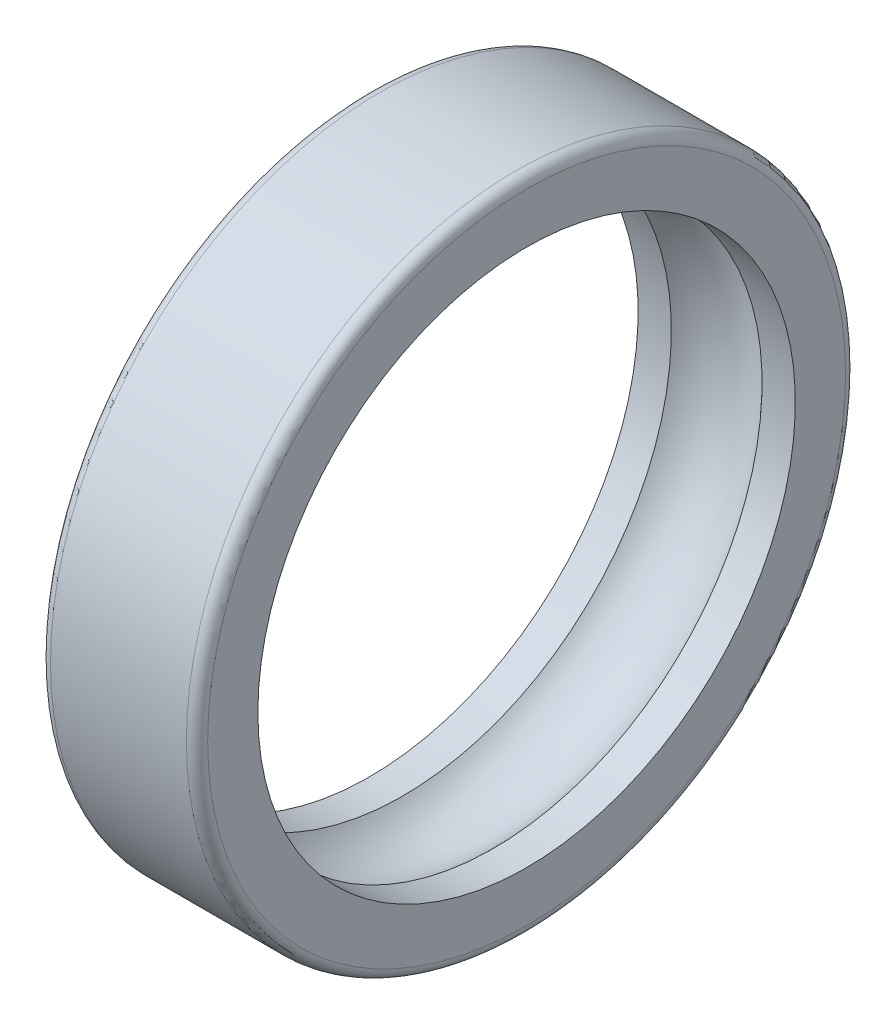
ISO-10303-21;
HEADER;
FILE_DESCRIPTION(('STEP AP214'),'2;1');
FILE_NAME('part.step','',(''),(''),'','','');
FILE_SCHEMA(('AUTOMOTIVE_DESIGN { 1 0 10303 214 1 1 1 1 }'));
ENDSEC;
DATA;
#1=APPLICATION_CONTEXT('core data for automotive mechanical design processes');
#2=APPLICATION_PROTOCOL_DEFINITION('international standard','automotive_design',2000,#1);
#3=PRODUCT_CONTEXT('',#1,'mechanical');
#4=PRODUCT('Part','Part','',(#3));
#5=PRODUCT_RELATED_PRODUCT_CATEGORY('part','',(#4));
#6=PRODUCT_DEFINITION_FORMATION('','',#4);
#7=PRODUCT_DEFINITION_CONTEXT('part definition',#1,'design');
#8=PRODUCT_DEFINITION('design','',#6,#7);
#9=PRODUCT_DEFINITION_SHAPE('','',#8);
#10=(LENGTH_UNIT() NAMED_UNIT(*) SI_UNIT(.MILLI.,.METRE.));
#11=(NAMED_UNIT(*) PLANE_ANGLE_UNIT() SI_UNIT($,.RADIAN.));
#12=(NAMED_UNIT(*) SI_UNIT($,.STERADIAN.) SOLID_ANGLE_UNIT());
#13=UNCERTAINTY_MEASURE_WITH_UNIT(LENGTH_MEASURE(1.E-05),#10,'distance_accuracy_value','');
#14=(GEOMETRIC_REPRESENTATION_CONTEXT(3) GLOBAL_UNCERTAINTY_ASSIGNED_CONTEXT((#13)) GLOBAL_UNIT_ASSIGNED_CONTEXT((#10,
#11,#12)) REPRESENTATION_CONTEXT('',''));
#15=CARTESIAN_POINT('',(0.,0.,0.));
#16=DIRECTION('',(0.,0.,1.));
#17=DIRECTION('',(1.,0.,0.));
#18=AXIS2_PLACEMENT_3D('',#15,#16,#17);
#19=CARTESIAN_POINT('',(-35.8469928467917,0.,0.));
#20=DIRECTION('',(-1.,0.,0.));
#21=DIRECTION('',(0.,0.,1.));
#22=AXIS2_PLACEMENT_3D('',#19,#20,#21);
#23=CYLINDRICAL_SURFACE('',#22,74.9213888883);
#24=CARTESIAN_POINT('',(21.91097222205,0.,0.));
#25=DIRECTION('',(-1.,0.,0.));
#26=DIRECTION('',(0.,0.,1.));
#27=AXIS2_PLACEMENT_3D('',#24,#25,#26);
#28=CIRCLE('',#27,74.9213888883);
#29=CARTESIAN_POINT('',(21.91097222205,0.,74.9213888883));
#30=VERTEX_POINT('',#29);
#31=EDGE_CURVE('E73',#30,#30,#28,.T.);
#32=ORIENTED_EDGE('',*,*,#31,.F.);
#33=EDGE_LOOP('',(#32));
#34=FACE_BOUND('',#33,.T.);
#35=CARTESIAN_POINT('',(12.6437221526744,0.,0.));
#36=DIRECTION('',(-1.,0.,0.));
#37=DIRECTION('',(0.,0.,1.));
#38=AXIS2_PLACEMENT_3D('',#35,#36,#37);
#39=CIRCLE('',#38,74.9213888883);
#40=CARTESIAN_POINT('',(12.6437221526744,0.,74.9213888883));
#41=VERTEX_POINT('',#40);
#42=EDGE_CURVE('E61',#41,#41,#39,.T.);
#43=ORIENTED_EDGE('',*,*,#42,.T.);
#44=EDGE_LOOP('',(#43));
#45=FACE_BOUND('',#44,.T.);
#46=ADVANCED_FACE('F37',(#34,#45),#23,.F.);
#47=CARTESIAN_POINT('',(0.,0.,0.));
#48=DIRECTION('',(-1.,0.,0.));
#49=DIRECTION('',(0.,0.,1.));
#50=AXIS2_PLACEMENT_3D('',#47,#48,#49);
#51=TOROIDAL_SURFACE('',#50,63.6124999995,16.9633333332);
#52=ORIENTED_EDGE('',*,*,#42,.F.);
#53=EDGE_LOOP('',(#52));
#54=FACE_BOUND('',#53,.T.);
#55=CARTESIAN_POINT('',(-12.6437221526744,0.,0.));
#56=DIRECTION('',(-1.,0.,0.));
#57=DIRECTION('',(0.,0.,1.));
#58=AXIS2_PLACEMENT_3D('',#55,#56,#57);
#59=CIRCLE('',#58,74.9213888883);
#60=CARTESIAN_POINT('',(-12.6437221526744,0.,74.9213888883));
#61=VERTEX_POINT('',#60);
#62=EDGE_CURVE('E65',#61,#61,#59,.T.);
#63=ORIENTED_EDGE('',*,*,#62,.T.);
#64=EDGE_LOOP('',(#63));
#65=FACE_BOUND('',#64,.T.);
#66=ADVANCED_FACE('F82',(#54,#65),#51,.F.);
#67=CARTESIAN_POINT('',(-35.8469928467917,0.,0.));
#68=DIRECTION('',(-1.,0.,0.));
#69=DIRECTION('',(0.,0.,1.));
#70=AXIS2_PLACEMENT_3D('',#67,#68,#69);
#71=CYLINDRICAL_SURFACE('',#70,74.9213888883);
#72=ORIENTED_EDGE('',*,*,#62,.F.);
#73=EDGE_LOOP('',(#72));
#74=FACE_BOUND('',#73,.T.);
#75=CARTESIAN_POINT('',(-21.91097222205,0.,0.));
#76=DIRECTION('',(-1.,0.,0.));
#77=DIRECTION('',(0.,0.,1.));
#78=AXIS2_PLACEMENT_3D('',#75,#76,#77);
#79=CIRCLE('',#78,74.9213888883);
#80=CARTESIAN_POINT('',(-21.91097222205,0.,74.9213888883));
#81=VERTEX_POINT('',#80);
#82=EDGE_CURVE('E69',#81,#81,#79,.T.);
#83=ORIENTED_EDGE('',*,*,#82,.T.);
#84=EDGE_LOOP('',(#83));
#85=FACE_BOUND('',#84,.T.);
#86=ADVANCED_FACE('F88',(#74,#85),#71,.F.);
#87=CARTESIAN_POINT('',(-21.91097222205,91.8847222215,0.));
#88=DIRECTION('',(1.,0.,0.));
#89=DIRECTION('',(0.,0.,-1.));
#90=AXIS2_PLACEMENT_3D('',#87,#88,#89);
#91=PLANE('',#90);
#92=CARTESIAN_POINT('',(-21.91097222205,0.,0.));
#93=DIRECTION('',(1.,0.,0.));
#94=DIRECTION('',(0.,0.,-1.));
#95=AXIS2_PLACEMENT_3D('',#92,#93,#94);
#96=CIRCLE('',#95,88.91613888819);
#97=CARTESIAN_POINT('',(-21.91097222205,0.,-88.91613888819));
#98=VERTEX_POINT('',#97);
#99=EDGE_CURVE('E10',#98,#98,#96,.F.);
#100=ORIENTED_EDGE('',*,*,#99,.T.);
#101=EDGE_LOOP('',(#100));
#102=FACE_BOUND('',#101,.T.);
#103=ORIENTED_EDGE('',*,*,#82,.F.);
#104=EDGE_LOOP('',(#103));
#105=FACE_BOUND('',#104,.T.);
#106=ADVANCED_FACE('F94',(#102,#105),#91,.F.);
#107=CARTESIAN_POINT('',(-35.8469928467917,0.,0.));
#108=DIRECTION('',(-1.,0.,0.));
#109=DIRECTION('',(0.,0.,1.));
#110=AXIS2_PLACEMENT_3D('',#107,#108,#109);
#111=CYLINDRICAL_SURFACE('',#110,91.8847222215);
#112=CARTESIAN_POINT('',(18.94238888874,0.,0.));
#113=DIRECTION('',(-1.,0.,0.));
#114=DIRECTION('',(0.,0.,1.));
#115=AXIS2_PLACEMENT_3D('',#112,#113,#114);
#116=CIRCLE('',#115,91.8847222215);
#117=CARTESIAN_POINT('',(18.94238888874,0.,91.8847222215));
#118=VERTEX_POINT('',#117);
#119=EDGE_CURVE('E50',#118,#118,#116,.T.);
#120=ORIENTED_EDGE('',*,*,#119,.T.);
#121=EDGE_LOOP('',(#120));
#122=FACE_BOUND('',#121,.T.);
#123=CARTESIAN_POINT('',(-18.94238888874,0.,0.));
#124=DIRECTION('',(1.,0.,0.));
#125=DIRECTION('',(0.,0.,-1.));
#126=AXIS2_PLACEMENT_3D('',#123,#124,#125);
#127=CIRCLE('',#126,91.8847222215);
#128=CARTESIAN_POINT('',(-18.94238888874,0.,-91.8847222215));
#129=VERTEX_POINT('',#128);
#130=EDGE_CURVE('E55',#129,#129,#127,.T.);
#131=ORIENTED_EDGE('',*,*,#130,.T.);
#132=EDGE_LOOP('',(#131));
#133=FACE_BOUND('',#132,.T.);
#134=ADVANCED_FACE('F99',(#122,#133),#111,.T.);
#135=CARTESIAN_POINT('',(21.91097222205,91.8847222215,0.));
#136=DIRECTION('',(-1.,0.,0.));
#137=DIRECTION('',(0.,0.,1.));
#138=AXIS2_PLACEMENT_3D('',#135,#136,#137);
#139=PLANE('',#138);
#140=CARTESIAN_POINT('',(21.91097222205,0.,0.));
#141=DIRECTION('',(-1.,0.,0.));
#142=DIRECTION('',(0.,0.,1.));
#143=AXIS2_PLACEMENT_3D('',#140,#141,#142);
#144=CIRCLE('',#143,88.91613888819);
#145=CARTESIAN_POINT('',(21.91097222205,0.,88.91613888819));
#146=VERTEX_POINT('',#145);
#147=EDGE_CURVE('E45',#146,#146,#144,.F.);
#148=ORIENTED_EDGE('',*,*,#147,.T.);
#149=EDGE_LOOP('',(#148));
#150=FACE_BOUND('',#149,.T.);
#151=ORIENTED_EDGE('',*,*,#31,.T.);
#152=EDGE_LOOP('',(#151));
#153=FACE_BOUND('',#152,.T.);
#154=ADVANCED_FACE('F78',(#150,#153),#139,.F.);
#155=CARTESIAN_POINT('',(18.94238888874,0.,0.));
#156=DIRECTION('',(-1.,0.,0.));
#157=DIRECTION('',(0.,0.,1.));
#158=AXIS2_PLACEMENT_3D('',#155,#156,#157);
#159=TOROIDAL_SURFACE('',#158,88.91613888819,2.96858333331);
#160=ORIENTED_EDGE('',*,*,#147,.F.);
#161=EDGE_LOOP('',(#160));
#162=FACE_BOUND('',#161,.T.);
#163=ORIENTED_EDGE('',*,*,#119,.F.);
#164=EDGE_LOOP('',(#163));
#165=FACE_BOUND('',#164,.T.);
#166=ADVANCED_FACE('F107',(#162,#165),#159,.T.);
#167=CARTESIAN_POINT('',(-18.94238888874,0.,0.));
#168=DIRECTION('',(1.,0.,0.));
#169=DIRECTION('',(0.,0.,-1.));
#170=AXIS2_PLACEMENT_3D('',#167,#168,#169);
#171=TOROIDAL_SURFACE('',#170,88.91613888819,2.96858333331);
#172=ORIENTED_EDGE('',*,*,#130,.F.);
#173=EDGE_LOOP('',(#172));
#174=FACE_BOUND('',#173,.T.);
#175=ORIENTED_EDGE('',*,*,#99,.F.);
#176=EDGE_LOOP('',(#175));
#177=FACE_BOUND('',#176,.T.);
#178=ADVANCED_FACE('F39',(#174,#177),#171,.T.);
#179=CLOSED_SHELL('',(#46,#66,#86,#106,#134,#154,#166,#178));
#180=MANIFOLD_SOLID_BREP('B2',#179);
#181=ADVANCED_BREP_SHAPE_REPRESENTATION('',(#18,#180),#14);
#182=SHAPE_DEFINITION_REPRESENTATION(#9,#181);
ENDSEC;
END-ISO-10303-21;
